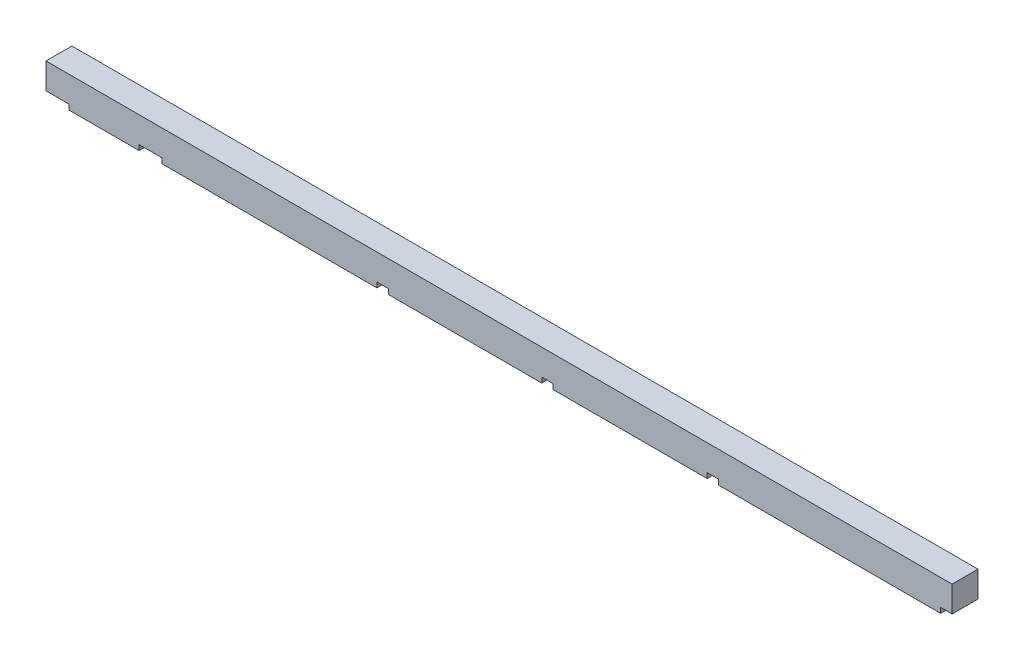
ISO-10303-21;
HEADER;
FILE_DESCRIPTION(('STEP AP214'),'2;1');
FILE_NAME('part.step','',(''),(''),'','','');
FILE_SCHEMA(('AUTOMOTIVE_DESIGN { 1 0 10303 214 1 1 1 1 }'));
ENDSEC;
DATA;
#1=APPLICATION_CONTEXT('core data for automotive mechanical design processes');
#2=APPLICATION_PROTOCOL_DEFINITION('international standard','automotive_design',2000,#1);
#3=PRODUCT_CONTEXT('',#1,'mechanical');
#4=PRODUCT('Part','Part','',(#3));
#5=PRODUCT_RELATED_PRODUCT_CATEGORY('part','',(#4));
#6=PRODUCT_DEFINITION_FORMATION('','',#4);
#7=PRODUCT_DEFINITION_CONTEXT('part definition',#1,'design');
#8=PRODUCT_DEFINITION('design','',#6,#7);
#9=PRODUCT_DEFINITION_SHAPE('','',#8);
#10=(LENGTH_UNIT() NAMED_UNIT(*) SI_UNIT(.MILLI.,.METRE.));
#11=(NAMED_UNIT(*) PLANE_ANGLE_UNIT() SI_UNIT($,.RADIAN.));
#12=(NAMED_UNIT(*) SI_UNIT($,.STERADIAN.) SOLID_ANGLE_UNIT());
#13=UNCERTAINTY_MEASURE_WITH_UNIT(LENGTH_MEASURE(1.E-05),#10,'distance_accuracy_value','');
#14=(GEOMETRIC_REPRESENTATION_CONTEXT(3) GLOBAL_UNCERTAINTY_ASSIGNED_CONTEXT((#13)) GLOBAL_UNIT_ASSIGNED_CONTEXT((#10,
#11,#12)) REPRESENTATION_CONTEXT('',''));
#15=CARTESIAN_POINT('',(0.,0.,0.));
#16=DIRECTION('',(0.,0.,1.));
#17=DIRECTION('',(1.,0.,0.));
#18=AXIS2_PLACEMENT_3D('',#15,#16,#17);
#19=CARTESIAN_POINT('',(67.2368086214332,3.63920301561666,5.));
#20=DIRECTION('',(-1.,0.,0.));
#21=DIRECTION('',(0.,0.,1.));
#22=AXIS2_PLACEMENT_3D('',#19,#20,#21);
#23=PLANE('',#22);
#24=DIRECTION('',(0.,1.,0.));
#25=VECTOR('',#24,1.);
#26=CARTESIAN_POINT('',(67.2368086214332,3.63920301561666,0.));
#27=LINE('',#26,#25);
#28=CARTESIAN_POINT('',(67.2368086214332,2.63920301561666,0.));
#29=VERTEX_POINT('',#28);
#30=CARTESIAN_POINT('',(67.2368086214332,3.63920301561666,0.));
#31=VERTEX_POINT('',#30);
#32=EDGE_CURVE('E236',#29,#31,#27,.T.);
#33=ORIENTED_EDGE('',*,*,#32,.T.);
#34=DIRECTION('',(0.,0.,-1.));
#35=VECTOR('',#34,1.);
#36=CARTESIAN_POINT('',(67.2368086214332,3.63920301561666,5.));
#37=LINE('',#36,#35);
#38=CARTESIAN_POINT('',(67.2368086214332,3.63920301561666,5.));
#39=VERTEX_POINT('',#38);
#40=EDGE_CURVE('E11',#39,#31,#37,.T.);
#41=ORIENTED_EDGE('',*,*,#40,.F.);
#42=DIRECTION('',(0.,1.,0.));
#43=VECTOR('',#42,1.);
#44=CARTESIAN_POINT('',(67.2368086214332,3.63920301561666,5.));
#45=LINE('',#44,#43);
#46=CARTESIAN_POINT('',(67.2368086214332,2.63920301561666,5.));
#47=VERTEX_POINT('',#46);
#48=EDGE_CURVE('E307',#47,#39,#45,.T.);
#49=ORIENTED_EDGE('',*,*,#48,.F.);
#50=DIRECTION('',(0.,0.,-1.));
#51=VECTOR('',#50,1.);
#52=CARTESIAN_POINT('',(67.2368086214332,2.63920301561666,5.));
#53=LINE('',#52,#51);
#54=EDGE_CURVE('E232',#47,#29,#53,.T.);
#55=ORIENTED_EDGE('',*,*,#54,.T.);
#56=EDGE_LOOP('',(#33,#41,#49,#55));
#57=FACE_BOUND('',#56,.T.);
#58=ADVANCED_FACE('F39',(#57),#23,.F.);
#59=CARTESIAN_POINT('',(67.2368086214332,3.63920301561666,5.));
#60=DIRECTION('',(0.,1.,0.));
#61=DIRECTION('',(0.,0.,1.));
#62=AXIS2_PLACEMENT_3D('',#59,#60,#61);
#63=PLANE('',#62);
#64=DIRECTION('',(1.,0.,0.));
#65=VECTOR('',#64,1.);
#66=CARTESIAN_POINT('',(67.2368086214332,3.63920301561666,0.));
#67=LINE('',#66,#65);
#68=CARTESIAN_POINT('',(69.4368086214342,3.63920301561666,0.));
#69=VERTEX_POINT('',#68);
#70=EDGE_CURVE('E240',#31,#69,#67,.T.);
#71=ORIENTED_EDGE('',*,*,#70,.T.);
#72=DIRECTION('',(0.,0.,-1.));
#73=VECTOR('',#72,1.);
#74=CARTESIAN_POINT('',(69.4368086214342,3.63920301561666,5.));
#75=LINE('',#74,#73);
#76=CARTESIAN_POINT('',(69.4368086214342,3.63920301561666,5.));
#77=VERTEX_POINT('',#76);
#78=EDGE_CURVE('E48',#77,#69,#75,.T.);
#79=ORIENTED_EDGE('',*,*,#78,.F.);
#80=DIRECTION('',(1.,0.,0.));
#81=VECTOR('',#80,1.);
#82=CARTESIAN_POINT('',(67.2368086214332,3.63920301561666,5.));
#83=LINE('',#82,#81);
#84=EDGE_CURVE('E147',#39,#77,#83,.T.);
#85=ORIENTED_EDGE('',*,*,#84,.F.);
#86=ORIENTED_EDGE('',*,*,#40,.T.);
#87=EDGE_LOOP('',(#71,#79,#85,#86));
#88=FACE_BOUND('',#87,.T.);
#89=ADVANCED_FACE('F485',(#88),#63,.F.);
#90=CARTESIAN_POINT('',(69.4368086214342,3.63920301561666,5.));
#91=DIRECTION('',(1.,0.,0.));
#92=DIRECTION('',(0.,0.,-1.));
#93=AXIS2_PLACEMENT_3D('',#90,#91,#92);
#94=PLANE('',#93);
#95=DIRECTION('',(0.,-1.,0.));
#96=VECTOR('',#95,1.);
#97=CARTESIAN_POINT('',(69.4368086214342,3.63920301561666,0.));
#98=LINE('',#97,#96);
#99=CARTESIAN_POINT('',(69.4368086214342,2.63920301561666,0.));
#100=VERTEX_POINT('',#99);
#101=EDGE_CURVE('E243',#69,#100,#98,.T.);
#102=ORIENTED_EDGE('',*,*,#101,.T.);
#103=DIRECTION('',(0.,0.,-1.));
#104=VECTOR('',#103,1.);
#105=CARTESIAN_POINT('',(69.4368086214342,2.63920301561666,5.));
#106=LINE('',#105,#104);
#107=CARTESIAN_POINT('',(69.4368086214342,2.63920301561666,5.));
#108=VERTEX_POINT('',#107);
#109=EDGE_CURVE('E382',#108,#100,#106,.T.);
#110=ORIENTED_EDGE('',*,*,#109,.F.);
#111=DIRECTION('',(0.,-1.,0.));
#112=VECTOR('',#111,1.);
#113=CARTESIAN_POINT('',(69.4368086214342,3.63920301561666,5.));
#114=LINE('',#113,#112);
#115=EDGE_CURVE('E392',#77,#108,#114,.T.);
#116=ORIENTED_EDGE('',*,*,#115,.F.);
#117=ORIENTED_EDGE('',*,*,#78,.T.);
#118=EDGE_LOOP('',(#102,#110,#116,#117));
#119=FACE_BOUND('',#118,.T.);
#120=ADVANCED_FACE('F390',(#119),#94,.F.);
#121=CARTESIAN_POINT('',(69.4368086214342,2.63920301561666,5.));
#122=DIRECTION('',(0.,1.,0.));
#123=DIRECTION('',(0.,0.,1.));
#124=AXIS2_PLACEMENT_3D('',#121,#122,#123);
#125=PLANE('',#124);
#126=DIRECTION('',(1.,0.,0.));
#127=VECTOR('',#126,1.);
#128=CARTESIAN_POINT('',(69.4368086214342,2.63920301561666,0.));
#129=LINE('',#128,#127);
#130=CARTESIAN_POINT('',(99.0833819533465,2.63920301561666,0.));
#131=VERTEX_POINT('',#130);
#132=EDGE_CURVE('E246',#100,#131,#129,.T.);
#133=ORIENTED_EDGE('',*,*,#132,.T.);
#134=DIRECTION('',(0.,0.,-1.));
#135=VECTOR('',#134,1.);
#136=CARTESIAN_POINT('',(99.0833819533465,2.63920301561666,5.));
#137=LINE('',#136,#135);
#138=CARTESIAN_POINT('',(99.0833819533465,2.63920301561666,5.));
#139=VERTEX_POINT('',#138);
#140=EDGE_CURVE('E378',#139,#131,#137,.T.);
#141=ORIENTED_EDGE('',*,*,#140,.F.);
#142=DIRECTION('',(1.,0.,0.));
#143=VECTOR('',#142,1.);
#144=CARTESIAN_POINT('',(69.4368086214342,2.63920301561666,5.));
#145=LINE('',#144,#143);
#146=EDGE_CURVE('E411',#108,#139,#145,.T.);
#147=ORIENTED_EDGE('',*,*,#146,.F.);
#148=ORIENTED_EDGE('',*,*,#109,.T.);
#149=EDGE_LOOP('',(#133,#141,#147,#148));
#150=FACE_BOUND('',#149,.T.);
#151=ADVANCED_FACE('F401',(#150),#125,.F.);
#152=CARTESIAN_POINT('',(99.0833819533465,3.63920301561666,5.));
#153=DIRECTION('',(-1.,0.,0.));
#154=DIRECTION('',(0.,0.,1.));
#155=AXIS2_PLACEMENT_3D('',#152,#153,#154);
#156=PLANE('',#155);
#157=DIRECTION('',(0.,1.,0.));
#158=VECTOR('',#157,1.);
#159=CARTESIAN_POINT('',(99.0833819533465,3.63920301561666,0.));
#160=LINE('',#159,#158);
#161=CARTESIAN_POINT('',(99.0833819533465,3.63920301561666,0.));
#162=VERTEX_POINT('',#161);
#163=EDGE_CURVE('E249',#131,#162,#160,.T.);
#164=ORIENTED_EDGE('',*,*,#163,.T.);
#165=DIRECTION('',(0.,0.,-1.));
#166=VECTOR('',#165,1.);
#167=CARTESIAN_POINT('',(99.0833819533465,3.63920301561666,5.));
#168=LINE('',#167,#166);
#169=CARTESIAN_POINT('',(99.0833819533465,3.63920301561666,5.));
#170=VERTEX_POINT('',#169);
#171=EDGE_CURVE('E374',#170,#162,#168,.T.);
#172=ORIENTED_EDGE('',*,*,#171,.F.);
#173=DIRECTION('',(0.,1.,0.));
#174=VECTOR('',#173,1.);
#175=CARTESIAN_POINT('',(99.0833819533465,3.63920301561666,5.));
#176=LINE('',#175,#174);
#177=EDGE_CURVE('E407',#139,#170,#176,.T.);
#178=ORIENTED_EDGE('',*,*,#177,.F.);
#179=ORIENTED_EDGE('',*,*,#140,.T.);
#180=EDGE_LOOP('',(#164,#172,#178,#179));
#181=FACE_BOUND('',#180,.T.);
#182=ADVANCED_FACE('F405',(#181),#156,.F.);
#183=CARTESIAN_POINT('',(101.283381953348,3.63920301561666,5.));
#184=DIRECTION('',(0.,1.,0.));
#185=DIRECTION('',(0.,0.,1.));
#186=AXIS2_PLACEMENT_3D('',#183,#184,#185);
#187=PLANE('',#186);
#188=DIRECTION('',(1.,0.,0.));
#189=VECTOR('',#188,1.);
#190=CARTESIAN_POINT('',(101.283381953348,3.63920301561666,0.));
#191=LINE('',#190,#189);
#192=CARTESIAN_POINT('',(101.283381953348,3.63920301561666,0.));
#193=VERTEX_POINT('',#192);
#194=EDGE_CURVE('E252',#162,#193,#191,.T.);
#195=ORIENTED_EDGE('',*,*,#194,.T.);
#196=DIRECTION('',(0.,0.,-1.));
#197=VECTOR('',#196,1.);
#198=CARTESIAN_POINT('',(101.283381953348,3.63920301561666,5.));
#199=LINE('',#198,#197);
#200=CARTESIAN_POINT('',(101.283381953348,3.63920301561666,5.));
#201=VERTEX_POINT('',#200);
#202=EDGE_CURVE('E370',#201,#193,#199,.T.);
#203=ORIENTED_EDGE('',*,*,#202,.F.);
#204=DIRECTION('',(1.,0.,0.));
#205=VECTOR('',#204,1.);
#206=CARTESIAN_POINT('',(101.283381953348,3.63920301561666,5.));
#207=LINE('',#206,#205);
#208=EDGE_CURVE('E410',#170,#201,#207,.T.);
#209=ORIENTED_EDGE('',*,*,#208,.F.);
#210=ORIENTED_EDGE('',*,*,#171,.T.);
#211=EDGE_LOOP('',(#195,#203,#209,#210));
#212=FACE_BOUND('',#211,.T.);
#213=ADVANCED_FACE('F498',(#212),#187,.F.);
#214=CARTESIAN_POINT('',(101.283381953348,2.63920301561666,5.));
#215=DIRECTION('',(1.,0.,0.));
#216=DIRECTION('',(0.,0.,-1.));
#217=AXIS2_PLACEMENT_3D('',#214,#215,#216);
#218=PLANE('',#217);
#219=DIRECTION('',(0.,-1.,0.));
#220=VECTOR('',#219,1.);
#221=CARTESIAN_POINT('',(101.283381953348,2.63920301561666,0.));
#222=LINE('',#221,#220);
#223=CARTESIAN_POINT('',(101.283381953348,2.63920301561666,0.));
#224=VERTEX_POINT('',#223);
#225=EDGE_CURVE('E255',#193,#224,#222,.T.);
#226=ORIENTED_EDGE('',*,*,#225,.T.);
#227=DIRECTION('',(0.,0.,-1.));
#228=VECTOR('',#227,1.);
#229=CARTESIAN_POINT('',(101.283381953348,2.63920301561666,5.));
#230=LINE('',#229,#228);
#231=CARTESIAN_POINT('',(101.283381953348,2.63920301561666,5.));
#232=VERTEX_POINT('',#231);
#233=EDGE_CURVE('E366',#232,#224,#230,.T.);
#234=ORIENTED_EDGE('',*,*,#233,.F.);
#235=DIRECTION('',(0.,-1.,0.));
#236=VECTOR('',#235,1.);
#237=CARTESIAN_POINT('',(101.283381953348,2.63920301561666,5.));
#238=LINE('',#237,#236);
#239=EDGE_CURVE('E415',#201,#232,#238,.T.);
#240=ORIENTED_EDGE('',*,*,#239,.F.);
#241=ORIENTED_EDGE('',*,*,#202,.T.);
#242=EDGE_LOOP('',(#226,#234,#240,#241));
#243=FACE_BOUND('',#242,.T.);
#244=ADVANCED_FACE('F501',(#243),#218,.F.);
#245=CARTESIAN_POINT('',(101.283381953348,2.63920301561666,5.));
#246=DIRECTION('',(0.,1.,0.));
#247=DIRECTION('',(0.,0.,1.));
#248=AXIS2_PLACEMENT_3D('',#245,#246,#247);
#249=PLANE('',#248);
#250=DIRECTION('',(1.,0.,0.));
#251=VECTOR('',#250,1.);
#252=CARTESIAN_POINT('',(101.283381953348,2.63920301561666,0.));
#253=LINE('',#252,#251);
#254=CARTESIAN_POINT('',(131.036653259871,2.63920301561666,0.));
#255=VERTEX_POINT('',#254);
#256=EDGE_CURVE('E258',#224,#255,#253,.T.);
#257=ORIENTED_EDGE('',*,*,#256,.T.);
#258=DIRECTION('',(0.,0.,-1.));
#259=VECTOR('',#258,1.);
#260=CARTESIAN_POINT('',(131.036653259871,2.63920301561666,5.));
#261=LINE('',#260,#259);
#262=CARTESIAN_POINT('',(131.036653259871,2.63920301561666,5.));
#263=VERTEX_POINT('',#262);
#264=EDGE_CURVE('E362',#263,#255,#261,.T.);
#265=ORIENTED_EDGE('',*,*,#264,.F.);
#266=DIRECTION('',(1.,0.,0.));
#267=VECTOR('',#266,1.);
#268=CARTESIAN_POINT('',(101.283381953348,2.63920301561666,5.));
#269=LINE('',#268,#267);
#270=EDGE_CURVE('E422',#232,#263,#269,.T.);
#271=ORIENTED_EDGE('',*,*,#270,.F.);
#272=ORIENTED_EDGE('',*,*,#233,.T.);
#273=EDGE_LOOP('',(#257,#265,#271,#272));
#274=FACE_BOUND('',#273,.T.);
#275=ADVANCED_FACE('F505',(#274),#249,.F.);
#276=CARTESIAN_POINT('',(131.036653259871,2.63920301561666,5.));
#277=DIRECTION('',(-1.,0.,0.));
#278=DIRECTION('',(0.,0.,1.));
#279=AXIS2_PLACEMENT_3D('',#276,#277,#278);
#280=PLANE('',#279);
#281=DIRECTION('',(0.,1.,0.));
#282=VECTOR('',#281,1.);
#283=CARTESIAN_POINT('',(131.036653259871,2.63920301561666,0.));
#284=LINE('',#283,#282);
#285=CARTESIAN_POINT('',(131.036653259871,3.62337357955425,0.));
#286=VERTEX_POINT('',#285);
#287=EDGE_CURVE('E261',#255,#286,#284,.T.);
#288=ORIENTED_EDGE('',*,*,#287,.T.);
#289=DIRECTION('',(0.,0.,-1.));
#290=VECTOR('',#289,1.);
#291=CARTESIAN_POINT('',(131.036653259871,3.62337357955425,5.));
#292=LINE('',#291,#290);
#293=CARTESIAN_POINT('',(131.036653259871,3.62337357955425,5.));
#294=VERTEX_POINT('',#293);
#295=EDGE_CURVE('E358',#294,#286,#292,.T.);
#296=ORIENTED_EDGE('',*,*,#295,.F.);
#297=DIRECTION('',(0.,1.,0.));
#298=VECTOR('',#297,1.);
#299=CARTESIAN_POINT('',(131.036653259871,2.63920301561666,5.));
#300=LINE('',#299,#298);
#301=EDGE_CURVE('E425',#263,#294,#300,.T.);
#302=ORIENTED_EDGE('',*,*,#301,.F.);
#303=ORIENTED_EDGE('',*,*,#264,.T.);
#304=EDGE_LOOP('',(#288,#296,#302,#303));
#305=FACE_BOUND('',#304,.T.);
#306=ADVANCED_FACE('F509',(#305),#280,.F.);
#307=CARTESIAN_POINT('',(131.036653259871,3.62337357955425,5.));
#308=DIRECTION('',(-0.00719706437055247,0.999974100796839,0.));
#309=DIRECTION('',(-0.999974100796839,-0.00719706437055247,0.));
#310=AXIS2_PLACEMENT_3D('',#307,#308,#309);
#311=PLANE('',#310);
#312=DIRECTION('',(0.999974100796839,0.00719706437055247,0.));
#313=VECTOR('',#312,1.);
#314=CARTESIAN_POINT('',(131.036653259871,3.62337357955425,0.));
#315=LINE('',#314,#313);
#316=CARTESIAN_POINT('',(133.236025848143,3.63920301561666,0.));
#317=VERTEX_POINT('',#316);
#318=EDGE_CURVE('E264',#286,#317,#315,.T.);
#319=ORIENTED_EDGE('',*,*,#318,.T.);
#320=DIRECTION('',(0.,0.,-1.));
#321=VECTOR('',#320,1.);
#322=CARTESIAN_POINT('',(133.236025848143,3.63920301561666,5.));
#323=LINE('',#322,#321);
#324=CARTESIAN_POINT('',(133.236025848143,3.63920301561666,5.));
#325=VERTEX_POINT('',#324);
#326=EDGE_CURVE('E354',#325,#317,#323,.T.);
#327=ORIENTED_EDGE('',*,*,#326,.F.);
#328=DIRECTION('',(0.999974100796839,0.00719706437055247,0.));
#329=VECTOR('',#328,1.);
#330=CARTESIAN_POINT('',(131.036653259871,3.62337357955425,5.));
#331=LINE('',#330,#329);
#332=EDGE_CURVE('E428',#294,#325,#331,.T.);
#333=ORIENTED_EDGE('',*,*,#332,.F.);
#334=ORIENTED_EDGE('',*,*,#295,.T.);
#335=EDGE_LOOP('',(#319,#327,#333,#334));
#336=FACE_BOUND('',#335,.T.);
#337=ADVANCED_FACE('F513',(#336),#311,.F.);
#338=CARTESIAN_POINT('',(133.236025848143,3.63920301561666,5.));
#339=DIRECTION('',(1.,0.,0.));
#340=DIRECTION('',(0.,0.,-1.));
#341=AXIS2_PLACEMENT_3D('',#338,#339,#340);
#342=PLANE('',#341);
#343=DIRECTION('',(0.,-1.,0.));
#344=VECTOR('',#343,1.);
#345=CARTESIAN_POINT('',(133.236025848143,3.63920301561666,0.));
#346=LINE('',#345,#344);
#347=CARTESIAN_POINT('',(133.236025848143,2.63920301561666,0.));
#348=VERTEX_POINT('',#347);
#349=EDGE_CURVE('E267',#317,#348,#346,.T.);
#350=ORIENTED_EDGE('',*,*,#349,.T.);
#351=DIRECTION('',(0.,0.,-1.));
#352=VECTOR('',#351,1.);
#353=CARTESIAN_POINT('',(133.236025848143,2.63920301561666,5.));
#354=LINE('',#353,#352);
#355=CARTESIAN_POINT('',(133.236025848143,2.63920301561666,5.));
#356=VERTEX_POINT('',#355);
#357=EDGE_CURVE('E350',#356,#348,#354,.T.);
#358=ORIENTED_EDGE('',*,*,#357,.F.);
#359=DIRECTION('',(0.,-1.,0.));
#360=VECTOR('',#359,1.);
#361=CARTESIAN_POINT('',(133.236025848143,3.63920301561666,5.));
#362=LINE('',#361,#360);
#363=EDGE_CURVE('E431',#325,#356,#362,.T.);
#364=ORIENTED_EDGE('',*,*,#363,.F.);
#365=ORIENTED_EDGE('',*,*,#326,.T.);
#366=EDGE_LOOP('',(#350,#358,#364,#365));
#367=FACE_BOUND('',#366,.T.);
#368=ADVANCED_FACE('F517',(#367),#342,.F.);
#369=CARTESIAN_POINT('',(133.236025848143,2.63920301561666,5.));
#370=DIRECTION('',(0.,1.,0.));
#371=DIRECTION('',(0.,0.,1.));
#372=AXIS2_PLACEMENT_3D('',#369,#370,#371);
#373=PLANE('',#372);
#374=DIRECTION('',(1.,0.,0.));
#375=VECTOR('',#374,1.);
#376=CARTESIAN_POINT('',(133.236025848143,2.63920301561666,0.));
#377=LINE('',#376,#375);
#378=CARTESIAN_POINT('',(176.136025848142,2.63920301561666,0.));
#379=VERTEX_POINT('',#378);
#380=EDGE_CURVE('E270',#348,#379,#377,.T.);
#381=ORIENTED_EDGE('',*,*,#380,.T.);
#382=DIRECTION('',(0.,0.,-1.));
#383=VECTOR('',#382,1.);
#384=CARTESIAN_POINT('',(176.136025848142,2.63920301561666,5.));
#385=LINE('',#384,#383);
#386=CARTESIAN_POINT('',(176.136025848142,2.63920301561666,5.));
#387=VERTEX_POINT('',#386);
#388=EDGE_CURVE('E346',#387,#379,#385,.T.);
#389=ORIENTED_EDGE('',*,*,#388,.F.);
#390=DIRECTION('',(1.,0.,0.));
#391=VECTOR('',#390,1.);
#392=CARTESIAN_POINT('',(133.236025848143,2.63920301561666,5.));
#393=LINE('',#392,#391);
#394=EDGE_CURVE('E434',#356,#387,#393,.T.);
#395=ORIENTED_EDGE('',*,*,#394,.F.);
#396=ORIENTED_EDGE('',*,*,#357,.T.);
#397=EDGE_LOOP('',(#381,#389,#395,#396));
#398=FACE_BOUND('',#397,.T.);
#399=ADVANCED_FACE('F521',(#398),#373,.F.);
#400=CARTESIAN_POINT('',(176.136025848142,2.63920301561666,5.));
#401=DIRECTION('',(-1.,0.,0.));
#402=DIRECTION('',(0.,0.,1.));
#403=AXIS2_PLACEMENT_3D('',#400,#401,#402);
#404=PLANE('',#403);
#405=DIRECTION('',(0.,1.,0.));
#406=VECTOR('',#405,1.);
#407=CARTESIAN_POINT('',(176.136025848142,2.63920301561666,0.));
#408=LINE('',#407,#406);
#409=CARTESIAN_POINT('',(176.136025848142,3.63920301561666,0.));
#410=VERTEX_POINT('',#409);
#411=EDGE_CURVE('E273',#379,#410,#408,.T.);
#412=ORIENTED_EDGE('',*,*,#411,.T.);
#413=DIRECTION('',(0.,0.,-1.));
#414=VECTOR('',#413,1.);
#415=CARTESIAN_POINT('',(176.136025848142,3.63920301561666,5.));
#416=LINE('',#415,#414);
#417=CARTESIAN_POINT('',(176.136025848142,3.63920301561666,5.));
#418=VERTEX_POINT('',#417);
#419=EDGE_CURVE('E342',#418,#410,#416,.T.);
#420=ORIENTED_EDGE('',*,*,#419,.F.);
#421=DIRECTION('',(0.,1.,0.));
#422=VECTOR('',#421,1.);
#423=CARTESIAN_POINT('',(176.136025848142,2.63920301561666,5.));
#424=LINE('',#423,#422);
#425=EDGE_CURVE('E437',#387,#418,#424,.T.);
#426=ORIENTED_EDGE('',*,*,#425,.F.);
#427=ORIENTED_EDGE('',*,*,#388,.T.);
#428=EDGE_LOOP('',(#412,#420,#426,#427));
#429=FACE_BOUND('',#428,.T.);
#430=ADVANCED_FACE('F525',(#429),#404,.F.);
#431=CARTESIAN_POINT('',(176.136025848142,3.63920301561666,5.));
#432=DIRECTION('',(0.,1.,0.));
#433=DIRECTION('',(0.,0.,1.));
#434=AXIS2_PLACEMENT_3D('',#431,#432,#433);
#435=PLANE('',#434);
#436=DIRECTION('',(1.,0.,0.));
#437=VECTOR('',#436,1.);
#438=CARTESIAN_POINT('',(176.136025848142,3.63920301561666,0.));
#439=LINE('',#438,#437);
#440=CARTESIAN_POINT('',(178.336025848142,3.63920301561666,0.));
#441=VERTEX_POINT('',#440);
#442=EDGE_CURVE('E276',#410,#441,#439,.T.);
#443=ORIENTED_EDGE('',*,*,#442,.T.);
#444=DIRECTION('',(0.,0.,-1.));
#445=VECTOR('',#444,1.);
#446=CARTESIAN_POINT('',(178.336025848142,3.63920301561666,5.));
#447=LINE('',#446,#445);
#448=CARTESIAN_POINT('',(178.336025848142,3.63920301561666,5.));
#449=VERTEX_POINT('',#448);
#450=EDGE_CURVE('E338',#449,#441,#447,.T.);
#451=ORIENTED_EDGE('',*,*,#450,.F.);
#452=DIRECTION('',(1.,0.,0.));
#453=VECTOR('',#452,1.);
#454=CARTESIAN_POINT('',(176.136025848142,3.63920301561666,5.));
#455=LINE('',#454,#453);
#456=EDGE_CURVE('E440',#418,#449,#455,.T.);
#457=ORIENTED_EDGE('',*,*,#456,.F.);
#458=ORIENTED_EDGE('',*,*,#419,.T.);
#459=EDGE_LOOP('',(#443,#451,#457,#458));
#460=FACE_BOUND('',#459,.T.);
#461=ADVANCED_FACE('F529',(#460),#435,.F.);
#462=CARTESIAN_POINT('',(178.336025848142,3.63920301561666,5.));
#463=DIRECTION('',(-1.,0.,0.));
#464=DIRECTION('',(0.,0.,1.));
#465=AXIS2_PLACEMENT_3D('',#462,#463,#464);
#466=PLANE('',#465);
#467=DIRECTION('',(0.,1.,0.));
#468=VECTOR('',#467,1.);
#469=CARTESIAN_POINT('',(178.336025848142,3.63920301561666,0.));
#470=LINE('',#469,#468);
#471=CARTESIAN_POINT('',(178.336025848142,8.63920301561643,0.));
#472=VERTEX_POINT('',#471);
#473=EDGE_CURVE('E279',#441,#472,#470,.T.);
#474=ORIENTED_EDGE('',*,*,#473,.T.);
#475=DIRECTION('',(0.,0.,-1.));
#476=VECTOR('',#475,1.);
#477=CARTESIAN_POINT('',(178.336025848142,8.63920301561643,5.));
#478=LINE('',#477,#476);
#479=CARTESIAN_POINT('',(178.336025848142,8.63920301561643,5.));
#480=VERTEX_POINT('',#479);
#481=EDGE_CURVE('E334',#480,#472,#478,.T.);
#482=ORIENTED_EDGE('',*,*,#481,.F.);
#483=DIRECTION('',(0.,1.,0.));
#484=VECTOR('',#483,1.);
#485=CARTESIAN_POINT('',(178.336025848142,3.63920301561666,5.));
#486=LINE('',#485,#484);
#487=EDGE_CURVE('E443',#449,#480,#486,.T.);
#488=ORIENTED_EDGE('',*,*,#487,.F.);
#489=ORIENTED_EDGE('',*,*,#450,.T.);
#490=EDGE_LOOP('',(#474,#482,#488,#489));
#491=FACE_BOUND('',#490,.T.);
#492=ADVANCED_FACE('F533',(#491),#466,.F.);
#493=CARTESIAN_POINT('',(50.3360258481421,8.63920301561643,5.));
#494=DIRECTION('',(0.,-1.,0.));
#495=DIRECTION('',(0.,0.,-1.));
#496=AXIS2_PLACEMENT_3D('',#493,#494,#495);
#497=PLANE('',#496);
#498=DIRECTION('',(-1.,0.,0.));
#499=VECTOR('',#498,1.);
#500=CARTESIAN_POINT('',(50.3360258481421,8.63920301561643,0.));
#501=LINE('',#500,#499);
#502=CARTESIAN_POINT('',(3.33602584814217,8.63920301561643,0.));
#503=VERTEX_POINT('',#502);
#504=EDGE_CURVE('E283',#472,#503,#501,.T.);
#505=ORIENTED_EDGE('',*,*,#504,.T.);
#506=DIRECTION('',(0.,0.,-1.));
#507=VECTOR('',#506,1.);
#508=CARTESIAN_POINT('',(3.33602584814217,8.63920301561643,5.));
#509=LINE('',#508,#507);
#510=CARTESIAN_POINT('',(3.33602584814217,8.63920301561643,5.));
#511=VERTEX_POINT('',#510);
#512=EDGE_CURVE('E330',#511,#503,#509,.T.);
#513=ORIENTED_EDGE('',*,*,#512,.F.);
#514=DIRECTION('',(-1.,0.,0.));
#515=VECTOR('',#514,1.);
#516=CARTESIAN_POINT('',(178.336025848142,8.63920301561643,5.));
#517=LINE('',#516,#515);
#518=EDGE_CURVE('E446',#480,#511,#517,.T.);
#519=ORIENTED_EDGE('',*,*,#518,.F.);
#520=ORIENTED_EDGE('',*,*,#481,.T.);
#521=EDGE_LOOP('',(#505,#513,#519,#520));
#522=FACE_BOUND('',#521,.T.);
#523=ADVANCED_FACE('F537',(#522),#497,.F.);
#524=CARTESIAN_POINT('',(3.33602584814217,8.63920301561643,5.));
#525=DIRECTION('',(1.,0.,0.));
#526=DIRECTION('',(0.,0.,-1.));
#527=AXIS2_PLACEMENT_3D('',#524,#525,#526);
#528=PLANE('',#527);
#529=DIRECTION('',(0.,-1.,0.));
#530=VECTOR('',#529,1.);
#531=CARTESIAN_POINT('',(3.33602584814217,8.63920301561643,0.));
#532=LINE('',#531,#530);
#533=CARTESIAN_POINT('',(3.33602584814217,3.63920301561666,0.));
#534=VERTEX_POINT('',#533);
#535=EDGE_CURVE('E286',#503,#534,#532,.T.);
#536=ORIENTED_EDGE('',*,*,#535,.T.);
#537=DIRECTION('',(0.,0.,-1.));
#538=VECTOR('',#537,1.);
#539=CARTESIAN_POINT('',(3.33602584814217,3.63920301561666,5.));
#540=LINE('',#539,#538);
#541=CARTESIAN_POINT('',(3.33602584814217,3.63920301561666,5.));
#542=VERTEX_POINT('',#541);
#543=EDGE_CURVE('E326',#542,#534,#540,.T.);
#544=ORIENTED_EDGE('',*,*,#543,.F.);
#545=DIRECTION('',(0.,-1.,0.));
#546=VECTOR('',#545,1.);
#547=CARTESIAN_POINT('',(3.33602584814217,8.63920301561643,5.));
#548=LINE('',#547,#546);
#549=EDGE_CURVE('E449',#511,#542,#548,.T.);
#550=ORIENTED_EDGE('',*,*,#549,.F.);
#551=ORIENTED_EDGE('',*,*,#512,.T.);
#552=EDGE_LOOP('',(#536,#544,#550,#551));
#553=FACE_BOUND('',#552,.T.);
#554=ADVANCED_FACE('F541',(#553),#528,.F.);
#555=CARTESIAN_POINT('',(3.33602584814217,3.63920301561666,5.));
#556=DIRECTION('',(0.,1.,0.));
#557=DIRECTION('',(0.,0.,1.));
#558=AXIS2_PLACEMENT_3D('',#555,#556,#557);
#559=PLANE('',#558);
#560=DIRECTION('',(1.,0.,0.));
#561=VECTOR('',#560,1.);
#562=CARTESIAN_POINT('',(3.33602584814217,3.63920301561666,0.));
#563=LINE('',#562,#561);
#564=CARTESIAN_POINT('',(7.73602584814218,3.63920301561666,0.));
#565=VERTEX_POINT('',#564);
#566=EDGE_CURVE('E289',#534,#565,#563,.T.);
#567=ORIENTED_EDGE('',*,*,#566,.T.);
#568=DIRECTION('',(0.,0.,-1.));
#569=VECTOR('',#568,1.);
#570=CARTESIAN_POINT('',(7.73602584814218,3.63920301561666,5.));
#571=LINE('',#570,#569);
#572=CARTESIAN_POINT('',(7.73602584814218,3.63920301561666,5.));
#573=VERTEX_POINT('',#572);
#574=EDGE_CURVE('E322',#573,#565,#571,.T.);
#575=ORIENTED_EDGE('',*,*,#574,.F.);
#576=DIRECTION('',(1.,0.,0.));
#577=VECTOR('',#576,1.);
#578=CARTESIAN_POINT('',(3.33602584814217,3.63920301561666,5.));
#579=LINE('',#578,#577);
#580=EDGE_CURVE('E452',#542,#573,#579,.T.);
#581=ORIENTED_EDGE('',*,*,#580,.F.);
#582=ORIENTED_EDGE('',*,*,#543,.T.);
#583=EDGE_LOOP('',(#567,#575,#581,#582));
#584=FACE_BOUND('',#583,.T.);
#585=ADVANCED_FACE('F545',(#584),#559,.F.);
#586=CARTESIAN_POINT('',(7.73602584814218,3.63920301561666,5.));
#587=DIRECTION('',(1.,0.,0.));
#588=DIRECTION('',(0.,0.,-1.));
#589=AXIS2_PLACEMENT_3D('',#586,#587,#588);
#590=PLANE('',#589);
#591=DIRECTION('',(0.,-1.,0.));
#592=VECTOR('',#591,1.);
#593=CARTESIAN_POINT('',(7.73602584814218,3.63920301561666,0.));
#594=LINE('',#593,#592);
#595=CARTESIAN_POINT('',(7.73602584814218,2.63920301561666,0.));
#596=VERTEX_POINT('',#595);
#597=EDGE_CURVE('E292',#565,#596,#594,.T.);
#598=ORIENTED_EDGE('',*,*,#597,.T.);
#599=DIRECTION('',(0.,0.,-1.));
#600=VECTOR('',#599,1.);
#601=CARTESIAN_POINT('',(7.73602584814218,2.63920301561666,5.));
#602=LINE('',#601,#600);
#603=CARTESIAN_POINT('',(7.73602584814218,2.63920301561666,5.));
#604=VERTEX_POINT('',#603);
#605=EDGE_CURVE('E318',#604,#596,#602,.T.);
#606=ORIENTED_EDGE('',*,*,#605,.F.);
#607=DIRECTION('',(0.,-1.,0.));
#608=VECTOR('',#607,1.);
#609=CARTESIAN_POINT('',(7.73602584814218,3.63920301561666,5.));
#610=LINE('',#609,#608);
#611=EDGE_CURVE('E455',#573,#604,#610,.T.);
#612=ORIENTED_EDGE('',*,*,#611,.F.);
#613=ORIENTED_EDGE('',*,*,#574,.T.);
#614=EDGE_LOOP('',(#598,#606,#612,#613));
#615=FACE_BOUND('',#614,.T.);
#616=ADVANCED_FACE('F549',(#615),#590,.F.);
#617=CARTESIAN_POINT('',(7.73602584814218,2.63920301561666,5.));
#618=DIRECTION('',(0.,1.,0.));
#619=DIRECTION('',(0.,0.,1.));
#620=AXIS2_PLACEMENT_3D('',#617,#618,#619);
#621=PLANE('',#620);
#622=DIRECTION('',(1.,0.,0.));
#623=VECTOR('',#622,1.);
#624=CARTESIAN_POINT('',(7.73602584814218,2.63920301561666,0.));
#625=LINE('',#624,#623);
#626=CARTESIAN_POINT('',(21.3082266037535,2.63920301561666,0.));
#627=VERTEX_POINT('',#626);
#628=EDGE_CURVE('E295',#596,#627,#625,.T.);
#629=ORIENTED_EDGE('',*,*,#628,.T.);
#630=DIRECTION('',(0.,0.,-1.));
#631=VECTOR('',#630,1.);
#632=CARTESIAN_POINT('',(21.3082266037535,2.63920301561666,5.));
#633=LINE('',#632,#631);
#634=CARTESIAN_POINT('',(21.3082266037535,2.63920301561666,5.));
#635=VERTEX_POINT('',#634);
#636=EDGE_CURVE('E314',#635,#627,#633,.T.);
#637=ORIENTED_EDGE('',*,*,#636,.F.);
#638=DIRECTION('',(1.,0.,0.));
#639=VECTOR('',#638,1.);
#640=CARTESIAN_POINT('',(7.73602584814218,2.63920301561666,5.));
#641=LINE('',#640,#639);
#642=EDGE_CURVE('E458',#604,#635,#641,.T.);
#643=ORIENTED_EDGE('',*,*,#642,.F.);
#644=ORIENTED_EDGE('',*,*,#605,.T.);
#645=EDGE_LOOP('',(#629,#637,#643,#644));
#646=FACE_BOUND('',#645,.T.);
#647=ADVANCED_FACE('F466',(#646),#621,.F.);
#648=CARTESIAN_POINT('',(21.3082266037535,2.63920301561666,5.));
#649=DIRECTION('',(-1.,0.,0.));
#650=DIRECTION('',(0.,0.,1.));
#651=AXIS2_PLACEMENT_3D('',#648,#649,#650);
#652=PLANE('',#651);
#653=DIRECTION('',(0.,1.,0.));
#654=VECTOR('',#653,1.);
#655=CARTESIAN_POINT('',(21.3082266037535,2.63920301561666,0.));
#656=LINE('',#655,#654);
#657=CARTESIAN_POINT('',(21.3082266037535,3.63920301561666,0.));
#658=VERTEX_POINT('',#657);
#659=EDGE_CURVE('E298',#627,#658,#656,.T.);
#660=ORIENTED_EDGE('',*,*,#659,.T.);
#661=DIRECTION('',(0.,0.,-1.));
#662=VECTOR('',#661,1.);
#663=CARTESIAN_POINT('',(21.3082266037535,3.63920301561666,5.));
#664=LINE('',#663,#662);
#665=CARTESIAN_POINT('',(21.3082266037535,3.63920301561666,5.));
#666=VERTEX_POINT('',#665);
#667=EDGE_CURVE('E225',#666,#658,#664,.T.);
#668=ORIENTED_EDGE('',*,*,#667,.F.);
#669=DIRECTION('',(0.,1.,0.));
#670=VECTOR('',#669,1.);
#671=CARTESIAN_POINT('',(21.3082266037535,2.63920301561666,5.));
#672=LINE('',#671,#670);
#673=EDGE_CURVE('E214',#635,#666,#672,.T.);
#674=ORIENTED_EDGE('',*,*,#673,.F.);
#675=ORIENTED_EDGE('',*,*,#636,.T.);
#676=EDGE_LOOP('',(#660,#668,#674,#675));
#677=FACE_BOUND('',#676,.T.);
#678=ADVANCED_FACE('F470',(#677),#652,.F.);
#679=CARTESIAN_POINT('',(21.3082266037535,3.63920301561666,5.));
#680=DIRECTION('',(0.,1.,0.));
#681=DIRECTION('',(0.,0.,1.));
#682=AXIS2_PLACEMENT_3D('',#679,#680,#681);
#683=PLANE('',#682);
#684=DIRECTION('',(1.,0.,0.));
#685=VECTOR('',#684,1.);
#686=CARTESIAN_POINT('',(21.3082266037535,3.63920301561666,0.));
#687=LINE('',#686,#685);
#688=CARTESIAN_POINT('',(25.7082266037537,3.63920301561666,0.));
#689=VERTEX_POINT('',#688);
#690=EDGE_CURVE('E223',#658,#689,#687,.T.);
#691=ORIENTED_EDGE('',*,*,#690,.T.);
#692=DIRECTION('',(0.,0.,-1.));
#693=VECTOR('',#692,1.);
#694=CARTESIAN_POINT('',(25.7082266037537,3.63920301561666,5.));
#695=LINE('',#694,#693);
#696=CARTESIAN_POINT('',(25.7082266037537,3.63920301561666,5.));
#697=VERTEX_POINT('',#696);
#698=EDGE_CURVE('E220',#697,#689,#695,.T.);
#699=ORIENTED_EDGE('',*,*,#698,.F.);
#700=DIRECTION('',(1.,0.,0.));
#701=VECTOR('',#700,1.);
#702=CARTESIAN_POINT('',(21.3082266037535,3.63920301561666,5.));
#703=LINE('',#702,#701);
#704=EDGE_CURVE('E208',#666,#697,#703,.T.);
#705=ORIENTED_EDGE('',*,*,#704,.F.);
#706=ORIENTED_EDGE('',*,*,#667,.T.);
#707=EDGE_LOOP('',(#691,#699,#705,#706));
#708=FACE_BOUND('',#707,.T.);
#709=ADVANCED_FACE('F221',(#708),#683,.F.);
#710=CARTESIAN_POINT('',(25.7082266037537,3.63920301561666,5.));
#711=DIRECTION('',(1.,0.,0.));
#712=DIRECTION('',(0.,0.,-1.));
#713=AXIS2_PLACEMENT_3D('',#710,#711,#712);
#714=PLANE('',#713);
#715=DIRECTION('',(0.,-1.,0.));
#716=VECTOR('',#715,1.);
#717=CARTESIAN_POINT('',(25.7082266037537,3.63920301561666,0.));
#718=LINE('',#717,#716);
#719=CARTESIAN_POINT('',(25.7082266037537,2.63920301561666,0.));
#720=VERTEX_POINT('',#719);
#721=EDGE_CURVE('E133',#689,#720,#718,.T.);
#722=ORIENTED_EDGE('',*,*,#721,.T.);
#723=DIRECTION('',(0.,0.,-1.));
#724=VECTOR('',#723,1.);
#725=CARTESIAN_POINT('',(25.7082266037537,2.63920301561666,5.));
#726=LINE('',#725,#724);
#727=CARTESIAN_POINT('',(25.7082266037537,2.63920301561666,5.));
#728=VERTEX_POINT('',#727);
#729=EDGE_CURVE('E226',#728,#720,#726,.T.);
#730=ORIENTED_EDGE('',*,*,#729,.F.);
#731=DIRECTION('',(0.,-1.,0.));
#732=VECTOR('',#731,1.);
#733=CARTESIAN_POINT('',(25.7082266037537,3.63920301561666,5.));
#734=LINE('',#733,#732);
#735=EDGE_CURVE('E212',#697,#728,#734,.T.);
#736=ORIENTED_EDGE('',*,*,#735,.F.);
#737=ORIENTED_EDGE('',*,*,#698,.T.);
#738=EDGE_LOOP('',(#722,#730,#736,#737));
#739=FACE_BOUND('',#738,.T.);
#740=ADVANCED_FACE('F228',(#739),#714,.F.);
#741=CARTESIAN_POINT('',(25.7082266037537,2.63920301561666,5.));
#742=DIRECTION('',(0.,1.,0.));
#743=DIRECTION('',(0.,0.,1.));
#744=AXIS2_PLACEMENT_3D('',#741,#742,#743);
#745=PLANE('',#744);
#746=DIRECTION('',(1.,0.,0.));
#747=VECTOR('',#746,1.);
#748=CARTESIAN_POINT('',(25.7082266037537,2.63920301561666,0.));
#749=LINE('',#748,#747);
#750=EDGE_CURVE('E139',#720,#29,#749,.T.);
#751=ORIENTED_EDGE('',*,*,#750,.T.);
#752=ORIENTED_EDGE('',*,*,#54,.F.);
#753=DIRECTION('',(1.,0.,0.));
#754=VECTOR('',#753,1.);
#755=CARTESIAN_POINT('',(25.7082266037537,2.63920301561666,5.));
#756=LINE('',#755,#754);
#757=EDGE_CURVE('E56',#728,#47,#756,.T.);
#758=ORIENTED_EDGE('',*,*,#757,.F.);
#759=ORIENTED_EDGE('',*,*,#729,.T.);
#760=EDGE_LOOP('',(#751,#752,#758,#759));
#761=FACE_BOUND('',#760,.T.);
#762=ADVANCED_FACE('F474',(#761),#745,.F.);
#763=CARTESIAN_POINT('',(0.,0.,5.));
#764=DIRECTION('',(0.,0.,1.));
#765=DIRECTION('',(1.,0.,0.));
#766=AXIS2_PLACEMENT_3D('',#763,#764,#765);
#767=PLANE('',#766);
#768=ORIENTED_EDGE('',*,*,#48,.T.);
#769=ORIENTED_EDGE('',*,*,#84,.T.);
#770=ORIENTED_EDGE('',*,*,#115,.T.);
#771=ORIENTED_EDGE('',*,*,#146,.T.);
#772=ORIENTED_EDGE('',*,*,#177,.T.);
#773=ORIENTED_EDGE('',*,*,#208,.T.);
#774=ORIENTED_EDGE('',*,*,#239,.T.);
#775=ORIENTED_EDGE('',*,*,#270,.T.);
#776=ORIENTED_EDGE('',*,*,#301,.T.);
#777=ORIENTED_EDGE('',*,*,#332,.T.);
#778=ORIENTED_EDGE('',*,*,#363,.T.);
#779=ORIENTED_EDGE('',*,*,#394,.T.);
#780=ORIENTED_EDGE('',*,*,#425,.T.);
#781=ORIENTED_EDGE('',*,*,#456,.T.);
#782=ORIENTED_EDGE('',*,*,#487,.T.);
#783=ORIENTED_EDGE('',*,*,#518,.T.);
#784=ORIENTED_EDGE('',*,*,#549,.T.);
#785=ORIENTED_EDGE('',*,*,#580,.T.);
#786=ORIENTED_EDGE('',*,*,#611,.T.);
#787=ORIENTED_EDGE('',*,*,#642,.T.);
#788=ORIENTED_EDGE('',*,*,#673,.T.);
#789=ORIENTED_EDGE('',*,*,#704,.T.);
#790=ORIENTED_EDGE('',*,*,#735,.T.);
#791=ORIENTED_EDGE('',*,*,#757,.T.);
#792=EDGE_LOOP('',(#768,#769,#770,#771,#772,#773,#774,#775,#776,#777,#778,#779,#780,#781,#782,
#783,#784,#785,#786,#787,#788,#789,#790,#791));
#793=FACE_BOUND('',#792,.T.);
#794=ADVANCED_FACE('F210',(#793),#767,.T.);
#795=CARTESIAN_POINT('',(0.,0.,0.));
#796=DIRECTION('',(0.,0.,1.));
#797=DIRECTION('',(1.,0.,0.));
#798=AXIS2_PLACEMENT_3D('',#795,#796,#797);
#799=PLANE('',#798);
#800=ORIENTED_EDGE('',*,*,#32,.F.);
#801=ORIENTED_EDGE('',*,*,#750,.F.);
#802=ORIENTED_EDGE('',*,*,#721,.F.);
#803=ORIENTED_EDGE('',*,*,#690,.F.);
#804=ORIENTED_EDGE('',*,*,#659,.F.);
#805=ORIENTED_EDGE('',*,*,#628,.F.);
#806=ORIENTED_EDGE('',*,*,#597,.F.);
#807=ORIENTED_EDGE('',*,*,#566,.F.);
#808=ORIENTED_EDGE('',*,*,#535,.F.);
#809=ORIENTED_EDGE('',*,*,#504,.F.);
#810=ORIENTED_EDGE('',*,*,#473,.F.);
#811=ORIENTED_EDGE('',*,*,#442,.F.);
#812=ORIENTED_EDGE('',*,*,#411,.F.);
#813=ORIENTED_EDGE('',*,*,#380,.F.);
#814=ORIENTED_EDGE('',*,*,#349,.F.);
#815=ORIENTED_EDGE('',*,*,#318,.F.);
#816=ORIENTED_EDGE('',*,*,#287,.F.);
#817=ORIENTED_EDGE('',*,*,#256,.F.);
#818=ORIENTED_EDGE('',*,*,#225,.F.);
#819=ORIENTED_EDGE('',*,*,#194,.F.);
#820=ORIENTED_EDGE('',*,*,#163,.F.);
#821=ORIENTED_EDGE('',*,*,#132,.F.);
#822=ORIENTED_EDGE('',*,*,#101,.F.);
#823=ORIENTED_EDGE('',*,*,#70,.F.);
#824=EDGE_LOOP('',(#800,#801,#802,#803,#804,#805,#806,#807,#808,#809,#810,#811,#812,#813,#814,
#815,#816,#817,#818,#819,#820,#821,#822,#823));
#825=FACE_BOUND('',#824,.T.);
#826=ADVANCED_FACE('F396',(#825),#799,.F.);
#827=CLOSED_SHELL('',(#58,#89,#120,#151,#182,#213,#244,#275,#306,#337,#368,#399,#430,#461,#492,
#523,#554,#585,#616,#647,#678,#709,#740,#762,#794,#826));
#828=MANIFOLD_SOLID_BREP('B2',#827);
#829=ADVANCED_BREP_SHAPE_REPRESENTATION('',(#18,#828),#14);
#830=SHAPE_DEFINITION_REPRESENTATION(#9,#829);
ENDSEC;
END-ISO-10303-21;
